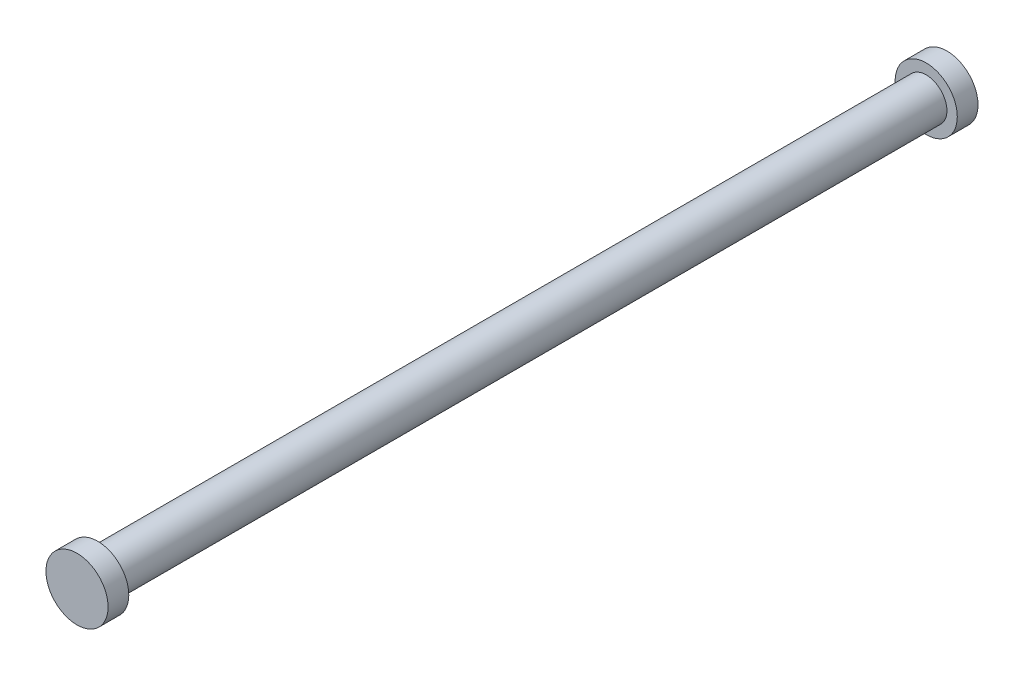
ISO-10303-21;
HEADER;
FILE_DESCRIPTION(('STEP AP214'),'2;1');
FILE_NAME('part.step','',(''),(''),'','','');
FILE_SCHEMA(('AUTOMOTIVE_DESIGN { 1 0 10303 214 1 1 1 1 }'));
ENDSEC;
DATA;
#1=APPLICATION_CONTEXT('core data for automotive mechanical design processes');
#2=APPLICATION_PROTOCOL_DEFINITION('international standard','automotive_design',2000,#1);
#3=PRODUCT_CONTEXT('',#1,'mechanical');
#4=PRODUCT('Part','Part','',(#3));
#5=PRODUCT_RELATED_PRODUCT_CATEGORY('part','',(#4));
#6=PRODUCT_DEFINITION_FORMATION('','',#4);
#7=PRODUCT_DEFINITION_CONTEXT('part definition',#1,'design');
#8=PRODUCT_DEFINITION('design','',#6,#7);
#9=PRODUCT_DEFINITION_SHAPE('','',#8);
#10=(LENGTH_UNIT() NAMED_UNIT(*) SI_UNIT(.MILLI.,.METRE.));
#11=(NAMED_UNIT(*) PLANE_ANGLE_UNIT() SI_UNIT($,.RADIAN.));
#12=(NAMED_UNIT(*) SI_UNIT($,.STERADIAN.) SOLID_ANGLE_UNIT());
#13=UNCERTAINTY_MEASURE_WITH_UNIT(LENGTH_MEASURE(1.E-05),#10,'distance_accuracy_value','');
#14=(GEOMETRIC_REPRESENTATION_CONTEXT(3) GLOBAL_UNCERTAINTY_ASSIGNED_CONTEXT((#13)) GLOBAL_UNIT_ASSIGNED_CONTEXT((#10,
#11,#12)) REPRESENTATION_CONTEXT('',''));
#15=CARTESIAN_POINT('',(0.,0.,0.));
#16=DIRECTION('',(0.,0.,1.));
#17=DIRECTION('',(1.,0.,0.));
#18=AXIS2_PLACEMENT_3D('',#15,#16,#17);
#19=CARTESIAN_POINT('',(0.,0.,40.));
#20=DIRECTION('',(0.,0.,-1.));
#21=DIRECTION('',(-1.,0.,0.));
#22=AXIS2_PLACEMENT_3D('',#19,#20,#21);
#23=CYLINDRICAL_SURFACE('',#22,1.);
#24=CARTESIAN_POINT('',(0.,0.,40.));
#25=DIRECTION('',(0.,0.,1.));
#26=DIRECTION('',(1.,0.,0.));
#27=AXIS2_PLACEMENT_3D('',#24,#25,#26);
#28=CIRCLE('',#27,1.);
#29=CARTESIAN_POINT('',(1.,0.,40.));
#30=VERTEX_POINT('',#29);
#31=EDGE_CURVE('E10',#30,#30,#28,.T.);
#32=ORIENTED_EDGE('',*,*,#31,.F.);
#33=EDGE_LOOP('',(#32));
#34=FACE_BOUND('',#33,.T.);
#35=CARTESIAN_POINT('',(0.,0.,0.));
#36=DIRECTION('',(0.,0.,1.));
#37=DIRECTION('',(1.,0.,0.));
#38=AXIS2_PLACEMENT_3D('',#35,#36,#37);
#39=CIRCLE('',#38,1.);
#40=CARTESIAN_POINT('',(1.,0.,0.));
#41=VERTEX_POINT('',#40);
#42=EDGE_CURVE('E34',#41,#41,#39,.T.);
#43=ORIENTED_EDGE('',*,*,#42,.T.);
#44=EDGE_LOOP('',(#43));
#45=FACE_BOUND('',#44,.T.);
#46=ADVANCED_FACE('F31',(#34,#45),#23,.T.);
#47=CARTESIAN_POINT('',(0.,0.,41.));
#48=DIRECTION('',(0.,0.,-1.));
#49=DIRECTION('',(-1.,0.,0.));
#50=AXIS2_PLACEMENT_3D('',#47,#48,#49);
#51=CYLINDRICAL_SURFACE('',#50,1.5);
#52=CARTESIAN_POINT('',(0.,0.,41.));
#53=DIRECTION('',(0.,0.,1.));
#54=DIRECTION('',(1.,0.,0.));
#55=AXIS2_PLACEMENT_3D('',#52,#53,#54);
#56=CIRCLE('',#55,1.5);
#57=CARTESIAN_POINT('',(1.5,0.,41.));
#58=VERTEX_POINT('',#57);
#59=EDGE_CURVE('E38',#58,#58,#56,.T.);
#60=ORIENTED_EDGE('',*,*,#59,.F.);
#61=EDGE_LOOP('',(#60));
#62=FACE_BOUND('',#61,.T.);
#63=CARTESIAN_POINT('',(0.,0.,40.));
#64=DIRECTION('',(0.,0.,1.));
#65=DIRECTION('',(1.,0.,0.));
#66=AXIS2_PLACEMENT_3D('',#63,#64,#65);
#67=CIRCLE('',#66,1.5);
#68=CARTESIAN_POINT('',(1.5,0.,40.));
#69=VERTEX_POINT('',#68);
#70=EDGE_CURVE('E42',#69,#69,#67,.T.);
#71=ORIENTED_EDGE('',*,*,#70,.T.);
#72=EDGE_LOOP('',(#71));
#73=FACE_BOUND('',#72,.T.);
#74=ADVANCED_FACE('F79',(#62,#73),#51,.T.);
#75=CARTESIAN_POINT('',(0.,0.,41.));
#76=DIRECTION('',(0.,0.,1.));
#77=DIRECTION('',(1.,0.,0.));
#78=AXIS2_PLACEMENT_3D('',#75,#76,#77);
#79=PLANE('',#78);
#80=ORIENTED_EDGE('',*,*,#59,.T.);
#81=EDGE_LOOP('',(#80));
#82=FACE_BOUND('',#81,.T.);
#83=ADVANCED_FACE('F75',(#82),#79,.T.);
#84=CARTESIAN_POINT('',(0.,0.,40.));
#85=DIRECTION('',(0.,0.,1.));
#86=DIRECTION('',(1.,0.,0.));
#87=AXIS2_PLACEMENT_3D('',#84,#85,#86);
#88=PLANE('',#87);
#89=ORIENTED_EDGE('',*,*,#31,.T.);
#90=EDGE_LOOP('',(#89));
#91=FACE_BOUND('',#90,.T.);
#92=ORIENTED_EDGE('',*,*,#70,.F.);
#93=EDGE_LOOP('',(#92));
#94=FACE_BOUND('',#93,.T.);
#95=ADVANCED_FACE('F67',(#91,#94),#88,.F.);
#96=CARTESIAN_POINT('',(0.,0.,-1.));
#97=DIRECTION('',(0.,0.,1.));
#98=DIRECTION('',(1.,0.,0.));
#99=AXIS2_PLACEMENT_3D('',#96,#97,#98);
#100=CYLINDRICAL_SURFACE('',#99,1.5);
#101=CARTESIAN_POINT('',(0.,0.,-1.));
#102=DIRECTION('',(0.,0.,1.));
#103=DIRECTION('',(1.,0.,0.));
#104=AXIS2_PLACEMENT_3D('',#101,#102,#103);
#105=CIRCLE('',#104,1.5);
#106=CARTESIAN_POINT('',(1.5,0.,-1.));
#107=VERTEX_POINT('',#106);
#108=EDGE_CURVE('E50',#107,#107,#105,.T.);
#109=ORIENTED_EDGE('',*,*,#108,.T.);
#110=EDGE_LOOP('',(#109));
#111=FACE_BOUND('',#110,.T.);
#112=CARTESIAN_POINT('',(0.,0.,0.));
#113=DIRECTION('',(0.,0.,1.));
#114=DIRECTION('',(1.,0.,0.));
#115=AXIS2_PLACEMENT_3D('',#112,#113,#114);
#116=CIRCLE('',#115,1.5);
#117=CARTESIAN_POINT('',(1.5,0.,0.));
#118=VERTEX_POINT('',#117);
#119=EDGE_CURVE('E47',#118,#118,#116,.T.);
#120=ORIENTED_EDGE('',*,*,#119,.F.);
#121=EDGE_LOOP('',(#120));
#122=FACE_BOUND('',#121,.T.);
#123=ADVANCED_FACE('F65',(#111,#122),#100,.T.);
#124=CARTESIAN_POINT('',(0.,0.,-1.));
#125=DIRECTION('',(0.,0.,-1.));
#126=DIRECTION('',(1.,0.,0.));
#127=AXIS2_PLACEMENT_3D('',#124,#125,#126);
#128=PLANE('',#127);
#129=ORIENTED_EDGE('',*,*,#108,.F.);
#130=EDGE_LOOP('',(#129));
#131=FACE_BOUND('',#130,.T.);
#132=ADVANCED_FACE('F61',(#131),#128,.T.);
#133=CARTESIAN_POINT('',(0.,0.,0.));
#134=DIRECTION('',(0.,0.,-1.));
#135=DIRECTION('',(1.,0.,0.));
#136=AXIS2_PLACEMENT_3D('',#133,#134,#135);
#137=PLANE('',#136);
#138=ORIENTED_EDGE('',*,*,#42,.F.);
#139=EDGE_LOOP('',(#138));
#140=FACE_BOUND('',#139,.T.);
#141=ORIENTED_EDGE('',*,*,#119,.T.);
#142=EDGE_LOOP('',(#141));
#143=FACE_BOUND('',#142,.T.);
#144=ADVANCED_FACE('F58',(#140,#143),#137,.F.);
#145=CLOSED_SHELL('',(#46,#74,#83,#95,#123,#132,#144));
#146=MANIFOLD_SOLID_BREP('B2',#145);
#147=ADVANCED_BREP_SHAPE_REPRESENTATION('',(#18,#146),#14);
#148=SHAPE_DEFINITION_REPRESENTATION(#9,#147);
ENDSEC;
END-ISO-10303-21;
